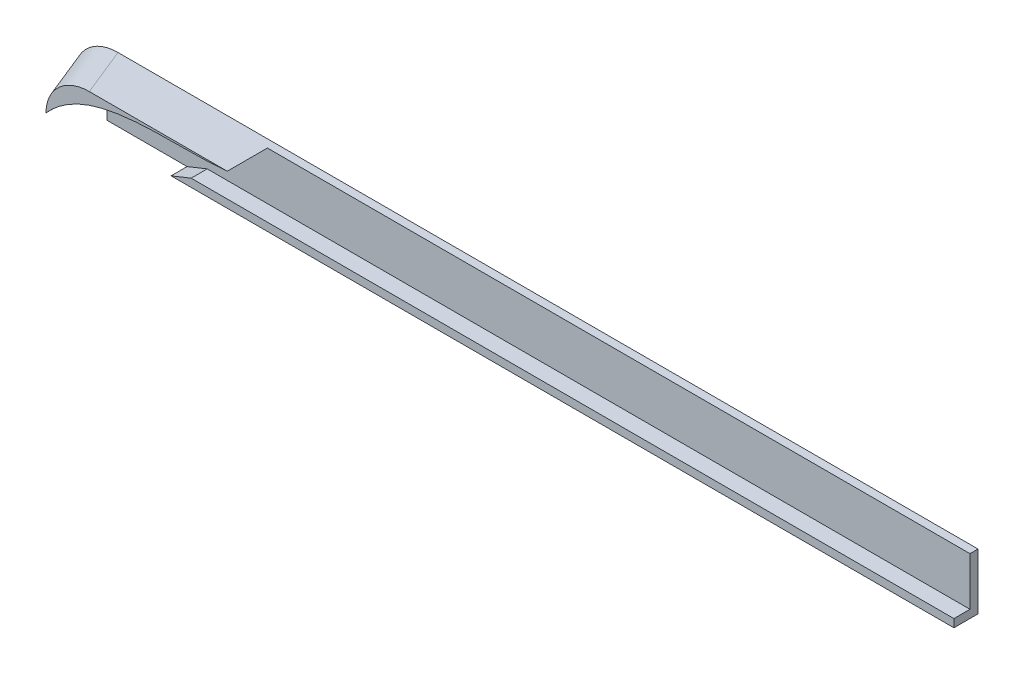
ISO-10303-21;
HEADER;
FILE_DESCRIPTION(('STEP AP214'),'2;1');
FILE_NAME('part.step','',(''),(''),'','','');
FILE_SCHEMA(('AUTOMOTIVE_DESIGN { 1 0 10303 214 1 1 1 1 }'));
ENDSEC;
DATA;
#1=APPLICATION_CONTEXT('core data for automotive mechanical design processes');
#2=APPLICATION_PROTOCOL_DEFINITION('international standard','automotive_design',2000,#1);
#3=PRODUCT_CONTEXT('',#1,'mechanical');
#4=PRODUCT('Part','Part','',(#3));
#5=PRODUCT_RELATED_PRODUCT_CATEGORY('part','',(#4));
#6=PRODUCT_DEFINITION_FORMATION('','',#4);
#7=PRODUCT_DEFINITION_CONTEXT('part definition',#1,'design');
#8=PRODUCT_DEFINITION('design','',#6,#7);
#9=PRODUCT_DEFINITION_SHAPE('','',#8);
#10=(LENGTH_UNIT() NAMED_UNIT(*) SI_UNIT(.MILLI.,.METRE.));
#11=(NAMED_UNIT(*) PLANE_ANGLE_UNIT() SI_UNIT($,.RADIAN.));
#12=(NAMED_UNIT(*) SI_UNIT($,.STERADIAN.) SOLID_ANGLE_UNIT());
#13=UNCERTAINTY_MEASURE_WITH_UNIT(LENGTH_MEASURE(1.E-05),#10,'distance_accuracy_value','');
#14=(GEOMETRIC_REPRESENTATION_CONTEXT(3) GLOBAL_UNCERTAINTY_ASSIGNED_CONTEXT((#13)) GLOBAL_UNIT_ASSIGNED_CONTEXT((#10,
#11,#12)) REPRESENTATION_CONTEXT('',''));
#15=CARTESIAN_POINT('',(0.,0.,0.));
#16=DIRECTION('',(0.,0.,1.));
#17=DIRECTION('',(1.,0.,0.));
#18=AXIS2_PLACEMENT_3D('',#15,#16,#17);
#19=CARTESIAN_POINT('',(-186.05,8.825,2.));
#20=DIRECTION('',(1.,0.,0.));
#21=DIRECTION('',(0.,0.,-1.));
#22=AXIS2_PLACEMENT_3D('',#19,#20,#21);
#23=PLANE('',#22);
#24=DIRECTION('',(0.,0.,-1.));
#25=VECTOR('',#24,1.);
#26=CARTESIAN_POINT('',(-186.05,-5.175,2.));
#27=LINE('',#26,#25);
#28=CARTESIAN_POINT('',(-186.05,-5.175,2.));
#29=VERTEX_POINT('',#28);
#30=CARTESIAN_POINT('',(-186.05,-5.175,0.));
#31=VERTEX_POINT('',#30);
#32=EDGE_CURVE('E209',#29,#31,#27,.T.);
#33=ORIENTED_EDGE('',*,*,#32,.F.);
#34=DIRECTION('',(0.,-1.,0.));
#35=VECTOR('',#34,1.);
#36=CARTESIAN_POINT('',(-186.05,8.825,2.));
#37=LINE('',#36,#35);
#38=CARTESIAN_POINT('',(-186.05,-1.17500000000001,2.));
#39=VERTEX_POINT('',#38);
#40=EDGE_CURVE('E190',#39,#29,#37,.T.);
#41=ORIENTED_EDGE('',*,*,#40,.F.);
#42=DIRECTION('',(0.,0.,-1.));
#43=VECTOR('',#42,1.);
#44=CARTESIAN_POINT('',(-186.05,-1.175,2.));
#45=LINE('',#44,#43);
#46=CARTESIAN_POINT('',(-186.05,-1.175,0.));
#47=VERTEX_POINT('',#46);
#48=EDGE_CURVE('E141',#39,#47,#45,.T.);
#49=ORIENTED_EDGE('',*,*,#48,.T.);
#50=DIRECTION('',(0.,-1.,0.));
#51=VECTOR('',#50,1.);
#52=CARTESIAN_POINT('',(-186.05,8.825,0.));
#53=LINE('',#52,#51);
#54=EDGE_CURVE('E189',#47,#31,#53,.T.);
#55=ORIENTED_EDGE('',*,*,#54,.T.);
#56=EDGE_LOOP('',(#33,#41,#49,#55));
#57=FACE_BOUND('',#56,.T.);
#58=ADVANCED_FACE('F39',(#57),#23,.F.);
#59=CARTESIAN_POINT('',(-186.05,-5.175,2.));
#60=DIRECTION('',(0.,1.,0.));
#61=DIRECTION('',(-1.,0.,0.));
#62=AXIS2_PLACEMENT_3D('',#59,#60,#61);
#63=PLANE('',#62);
#64=DIRECTION('',(1.,0.,0.));
#65=VECTOR('',#64,1.);
#66=CARTESIAN_POINT('',(-186.05,-5.175,6.));
#67=LINE('',#66,#65);
#68=CARTESIAN_POINT('',(-166.05,-5.175,6.));
#69=VERTEX_POINT('',#68);
#70=CARTESIAN_POINT('',(28.95,-5.175,6.));
#71=VERTEX_POINT('',#70);
#72=EDGE_CURVE('E177',#69,#71,#67,.T.);
#73=ORIENTED_EDGE('',*,*,#72,.F.);
#74=DIRECTION('',(0.,0.,1.));
#75=VECTOR('',#74,1.);
#76=CARTESIAN_POINT('',(-166.05,-5.175,2.));
#77=LINE('',#76,#75);
#78=CARTESIAN_POINT('',(-166.05,-5.175,2.));
#79=VERTEX_POINT('',#78);
#80=EDGE_CURVE('E167',#79,#69,#77,.T.);
#81=ORIENTED_EDGE('',*,*,#80,.F.);
#82=DIRECTION('',(1.,0.,0.));
#83=VECTOR('',#82,1.);
#84=CARTESIAN_POINT('',(-166.05,-5.175,2.));
#85=LINE('',#84,#83);
#86=EDGE_CURVE('E161',#29,#79,#85,.T.);
#87=ORIENTED_EDGE('',*,*,#86,.F.);
#88=ORIENTED_EDGE('',*,*,#32,.T.);
#89=DIRECTION('',(1.,0.,0.));
#90=VECTOR('',#89,1.);
#91=CARTESIAN_POINT('',(-186.05,-5.175,0.));
#92=LINE('',#91,#90);
#93=CARTESIAN_POINT('',(28.95,-5.175,0.));
#94=VERTEX_POINT('',#93);
#95=EDGE_CURVE('E199',#31,#94,#92,.T.);
#96=ORIENTED_EDGE('',*,*,#95,.T.);
#97=DIRECTION('',(0.,0.,-1.));
#98=VECTOR('',#97,1.);
#99=CARTESIAN_POINT('',(28.95,-5.175,2.));
#100=LINE('',#99,#98);
#101=EDGE_CURVE('E206',#71,#94,#100,.T.);
#102=ORIENTED_EDGE('',*,*,#101,.F.);
#103=EDGE_LOOP('',(#73,#81,#87,#88,#96,#102));
#104=FACE_BOUND('',#103,.T.);
#105=ADVANCED_FACE('F215',(#104),#63,.F.);
#106=CARTESIAN_POINT('',(28.95,8.825,2.));
#107=DIRECTION('',(-1.,0.,0.));
#108=DIRECTION('',(0.,0.,1.));
#109=AXIS2_PLACEMENT_3D('',#106,#107,#108);
#110=PLANE('',#109);
#111=DIRECTION('',(0.,1.,0.));
#112=VECTOR('',#111,1.);
#113=CARTESIAN_POINT('',(28.95,8.825,0.));
#114=LINE('',#113,#112);
#115=CARTESIAN_POINT('',(28.95,8.825,0.));
#116=VERTEX_POINT('',#115);
#117=EDGE_CURVE('E201',#94,#116,#114,.T.);
#118=ORIENTED_EDGE('',*,*,#117,.T.);
#119=DIRECTION('',(0.,0.,-1.));
#120=VECTOR('',#119,1.);
#121=CARTESIAN_POINT('',(28.95,8.825,2.));
#122=LINE('',#121,#120);
#123=CARTESIAN_POINT('',(28.95,8.825,2.));
#124=VERTEX_POINT('',#123);
#125=EDGE_CURVE('E196',#124,#116,#122,.T.);
#126=ORIENTED_EDGE('',*,*,#125,.F.);
#127=DIRECTION('',(0.,1.,0.));
#128=VECTOR('',#127,1.);
#129=CARTESIAN_POINT('',(28.95,8.825,2.));
#130=LINE('',#129,#128);
#131=CARTESIAN_POINT('',(28.95,-3.175,2.));
#132=VERTEX_POINT('',#131);
#133=EDGE_CURVE('E192',#132,#124,#130,.T.);
#134=ORIENTED_EDGE('',*,*,#133,.F.);
#135=DIRECTION('',(0.,0.,-1.));
#136=VECTOR('',#135,1.);
#137=CARTESIAN_POINT('',(28.95,-3.175,6.));
#138=LINE('',#137,#136);
#139=CARTESIAN_POINT('',(28.95,-3.175,6.));
#140=VERTEX_POINT('',#139);
#141=EDGE_CURVE('E184',#140,#132,#138,.T.);
#142=ORIENTED_EDGE('',*,*,#141,.F.);
#143=DIRECTION('',(0.,1.,0.));
#144=VECTOR('',#143,1.);
#145=CARTESIAN_POINT('',(28.95,-5.175,6.));
#146=LINE('',#145,#144);
#147=EDGE_CURVE('E179',#71,#140,#146,.T.);
#148=ORIENTED_EDGE('',*,*,#147,.F.);
#149=ORIENTED_EDGE('',*,*,#101,.T.);
#150=EDGE_LOOP('',(#118,#126,#134,#142,#148,#149));
#151=FACE_BOUND('',#150,.T.);
#152=ADVANCED_FACE('F225',(#151),#110,.F.);
#153=CARTESIAN_POINT('',(-186.05,8.825,2.));
#154=DIRECTION('',(0.,-1.,0.));
#155=DIRECTION('',(0.,0.,-1.));
#156=AXIS2_PLACEMENT_3D('',#153,#154,#155);
#157=PLANE('',#156);
#158=DIRECTION('',(-1.,0.,0.));
#159=VECTOR('',#158,1.);
#160=CARTESIAN_POINT('',(-186.05,8.825,0.));
#161=LINE('',#160,#159);
#162=CARTESIAN_POINT('',(-185.264652573224,8.825,0.));
#163=VERTEX_POINT('',#162);
#164=EDGE_CURVE('E193',#116,#163,#161,.T.);
#165=ORIENTED_EDGE('',*,*,#164,.T.);
#166=DIRECTION('',(-0.374606593415917,0.,-0.927183854566786));
#167=VECTOR('',#166,1.);
#168=CARTESIAN_POINT('',(-184.680202085566,8.825,1.44656571847451));
#169=LINE('',#168,#167);
#170=CARTESIAN_POINT('',(-180.416337863202,8.82499999999999,12.));
#171=VERTEX_POINT('',#170);
#172=EDGE_CURVE('E47',#163,#171,#169,.F.);
#173=ORIENTED_EDGE('',*,*,#172,.T.);
#174=DIRECTION('',(1.,0.,0.));
#175=VECTOR('',#174,1.);
#176=CARTESIAN_POINT('',(-196.05,8.82499999999999,12.));
#177=LINE('',#176,#175);
#178=CARTESIAN_POINT('',(-146.05,8.82499999999999,12.));
#179=VERTEX_POINT('',#178);
#180=EDGE_CURVE('E158',#171,#179,#177,.T.);
#181=ORIENTED_EDGE('',*,*,#180,.T.);
#182=DIRECTION('',(0.,0.,1.));
#183=VECTOR('',#182,1.);
#184=CARTESIAN_POINT('',(-146.05,8.825,2.));
#185=LINE('',#184,#183);
#186=CARTESIAN_POINT('',(-146.05,8.82499999999999,2.));
#187=VERTEX_POINT('',#186);
#188=EDGE_CURVE('E156',#187,#179,#185,.T.);
#189=ORIENTED_EDGE('',*,*,#188,.F.);
#190=DIRECTION('',(-1.,0.,0.));
#191=VECTOR('',#190,1.);
#192=CARTESIAN_POINT('',(-186.05,8.825,2.));
#193=LINE('',#192,#191);
#194=EDGE_CURVE('E137',#124,#187,#193,.T.);
#195=ORIENTED_EDGE('',*,*,#194,.F.);
#196=ORIENTED_EDGE('',*,*,#125,.T.);
#197=EDGE_LOOP('',(#165,#173,#181,#189,#195,#196));
#198=FACE_BOUND('',#197,.T.);
#199=ADVANCED_FACE('F228',(#198),#157,.F.);
#200=CARTESIAN_POINT('',(0.,0.,2.));
#201=DIRECTION('',(0.,0.,1.));
#202=DIRECTION('',(1.,0.,0.));
#203=AXIS2_PLACEMENT_3D('',#200,#201,#202);
#204=PLANE('',#203);
#205=DIRECTION('',(1.,0.,0.));
#206=VECTOR('',#205,1.);
#207=CARTESIAN_POINT('',(-191.201685289978,-1.17500000000001,2.));
#208=LINE('',#207,#206);
#209=CARTESIAN_POINT('',(-191.201685289978,-1.17500000000001,2.));
#210=VERTEX_POINT('',#209);
#211=EDGE_CURVE('E130',#210,#39,#208,.T.);
#212=ORIENTED_EDGE('',*,*,#211,.T.);
#213=ORIENTED_EDGE('',*,*,#40,.T.);
#214=ORIENTED_EDGE('',*,*,#86,.T.);
#215=DIRECTION('',(0.928476690885259,0.371390676354104,0.));
#216=VECTOR('',#215,1.);
#217=CARTESIAN_POINT('',(-161.05,-3.175,2.));
#218=LINE('',#217,#216);
#219=CARTESIAN_POINT('',(-161.05,-3.175,2.));
#220=VERTEX_POINT('',#219);
#221=EDGE_CURVE('E164',#79,#220,#218,.T.);
#222=ORIENTED_EDGE('',*,*,#221,.T.);
#223=DIRECTION('',(-1.,0.,0.));
#224=VECTOR('',#223,1.);
#225=CARTESIAN_POINT('',(-186.05,-3.175,2.));
#226=LINE('',#225,#224);
#227=EDGE_CURVE('E176',#132,#220,#226,.T.);
#228=ORIENTED_EDGE('',*,*,#227,.F.);
#229=ORIENTED_EDGE('',*,*,#133,.T.);
#230=ORIENTED_EDGE('',*,*,#194,.T.);
#231=CARTESIAN_POINT('',(-146.05,8.82499999999999,2.));
#232=CARTESIAN_POINT('',(-160.70624820226,7.33433041919374,2.));
#233=CARTESIAN_POINT('',(-180.093995007312,11.3348953174349,2.));
#234=CARTESIAN_POINT('',(-191.201685289978,-1.17500000000001,2.));
#235=B_SPLINE_CURVE_WITH_KNOTS('',3,(#231,#232,#233,#234),.UNSPECIFIED.,.F.,.F.,(4,4),(0.,1.),.UNSPECIFIED.);
#236=EDGE_CURVE('E122',#187,#210,#235,.T.);
#237=ORIENTED_EDGE('',*,*,#236,.T.);
#238=EDGE_LOOP('',(#212,#213,#214,#222,#228,#229,#230,#237));
#239=FACE_BOUND('',#238,.T.);
#240=ADVANCED_FACE('F134',(#239),#204,.T.);
#241=CARTESIAN_POINT('',(0.,0.,0.));
#242=DIRECTION('',(0.,0.,1.));
#243=DIRECTION('',(1.,0.,0.));
#244=AXIS2_PLACEMENT_3D('',#241,#242,#243);
#245=PLANE('',#244);
#246=DIRECTION('',(-1.,0.,0.));
#247=VECTOR('',#246,1.);
#248=CARTESIAN_POINT('',(-186.05,-1.175,0.));
#249=LINE('',#248,#247);
#250=CARTESIAN_POINT('',(-196.05,-1.175,0.));
#251=VERTEX_POINT('',#250);
#252=EDGE_CURVE('E172',#47,#251,#249,.T.);
#253=ORIENTED_EDGE('',*,*,#252,.T.);
#254=CARTESIAN_POINT('',(-185.264652573224,-1.175,0.));
#255=DIRECTION('',(0.,0.,1.));
#256=DIRECTION('',(-1.,0.,0.));
#257=AXIS2_PLACEMENT_3D('',#254,#255,#256);
#258=ELLIPSE('',#257,10.7853474267759,10.);
#259=EDGE_CURVE('E61',#251,#163,#258,.F.);
#260=ORIENTED_EDGE('',*,*,#259,.T.);
#261=ORIENTED_EDGE('',*,*,#164,.F.);
#262=ORIENTED_EDGE('',*,*,#117,.F.);
#263=ORIENTED_EDGE('',*,*,#95,.F.);
#264=ORIENTED_EDGE('',*,*,#54,.F.);
#265=EDGE_LOOP('',(#253,#260,#261,#262,#263,#264));
#266=FACE_BOUND('',#265,.T.);
#267=ADVANCED_FACE('F222',(#266),#245,.F.);
#268=CARTESIAN_POINT('',(-186.05,-3.175,6.));
#269=DIRECTION('',(0.,-1.,0.));
#270=DIRECTION('',(0.,0.,-1.));
#271=AXIS2_PLACEMENT_3D('',#268,#269,#270);
#272=PLANE('',#271);
#273=ORIENTED_EDGE('',*,*,#227,.T.);
#274=DIRECTION('',(0.,0.,1.));
#275=VECTOR('',#274,1.);
#276=CARTESIAN_POINT('',(-161.05,-3.175,2.));
#277=LINE('',#276,#275);
#278=CARTESIAN_POINT('',(-161.05,-3.175,6.));
#279=VERTEX_POINT('',#278);
#280=EDGE_CURVE('E169',#220,#279,#277,.T.);
#281=ORIENTED_EDGE('',*,*,#280,.T.);
#282=DIRECTION('',(-1.,0.,0.));
#283=VECTOR('',#282,1.);
#284=CARTESIAN_POINT('',(-186.05,-3.175,6.));
#285=LINE('',#284,#283);
#286=EDGE_CURVE('E181',#140,#279,#285,.T.);
#287=ORIENTED_EDGE('',*,*,#286,.F.);
#288=ORIENTED_EDGE('',*,*,#141,.T.);
#289=EDGE_LOOP('',(#273,#281,#287,#288));
#290=FACE_BOUND('',#289,.T.);
#291=ADVANCED_FACE('F253',(#290),#272,.F.);
#292=CARTESIAN_POINT('',(0.,0.,6.));
#293=DIRECTION('',(0.,0.,-1.));
#294=DIRECTION('',(-1.,0.,0.));
#295=AXIS2_PLACEMENT_3D('',#292,#293,#294);
#296=PLANE('',#295);
#297=ORIENTED_EDGE('',*,*,#286,.T.);
#298=DIRECTION('',(0.928476690885259,0.371390676354104,0.));
#299=VECTOR('',#298,1.);
#300=CARTESIAN_POINT('',(-161.05,-3.175,6.));
#301=LINE('',#300,#299);
#302=EDGE_CURVE('E160',#69,#279,#301,.T.);
#303=ORIENTED_EDGE('',*,*,#302,.F.);
#304=ORIENTED_EDGE('',*,*,#72,.T.);
#305=ORIENTED_EDGE('',*,*,#147,.T.);
#306=EDGE_LOOP('',(#297,#303,#304,#305));
#307=FACE_BOUND('',#306,.T.);
#308=ADVANCED_FACE('F258',(#307),#296,.F.);
#309=CARTESIAN_POINT('',(-186.05,-1.175,2.));
#310=DIRECTION('',(0.,-1.,0.));
#311=DIRECTION('',(0.,0.,-1.));
#312=AXIS2_PLACEMENT_3D('',#309,#310,#311);
#313=PLANE('',#312);
#314=DIRECTION('',(0.,0.,1.));
#315=VECTOR('',#314,1.);
#316=CARTESIAN_POINT('',(-191.201685289978,-1.17500000000001,2.));
#317=LINE('',#316,#315);
#318=CARTESIAN_POINT('',(-191.201685289978,-1.17500000000001,12.));
#319=VERTEX_POINT('',#318);
#320=EDGE_CURVE('E119',#210,#319,#317,.T.);
#321=ORIENTED_EDGE('',*,*,#320,.T.);
#322=DIRECTION('',(0.374606593415917,0.,0.927183854566786));
#323=VECTOR('',#322,1.);
#324=CARTESIAN_POINT('',(-193.952040631234,-1.175,5.19263165263367));
#325=LINE('',#324,#323);
#326=EDGE_CURVE('E129',#251,#319,#325,.T.);
#327=ORIENTED_EDGE('',*,*,#326,.F.);
#328=ORIENTED_EDGE('',*,*,#252,.F.);
#329=ORIENTED_EDGE('',*,*,#48,.F.);
#330=ORIENTED_EDGE('',*,*,#211,.F.);
#331=EDGE_LOOP('',(#321,#327,#328,#329,#330));
#332=FACE_BOUND('',#331,.T.);
#333=ADVANCED_FACE('F139',(#332),#313,.T.);
#334=CARTESIAN_POINT('',(-161.05,-3.175,2.));
#335=DIRECTION('',(0.371390676354104,-0.928476690885259,0.));
#336=DIRECTION('',(0.928476690885259,0.371390676354104,0.));
#337=AXIS2_PLACEMENT_3D('',#334,#335,#336);
#338=PLANE('',#337);
#339=ORIENTED_EDGE('',*,*,#302,.T.);
#340=ORIENTED_EDGE('',*,*,#280,.F.);
#341=ORIENTED_EDGE('',*,*,#221,.F.);
#342=ORIENTED_EDGE('',*,*,#80,.T.);
#343=EDGE_LOOP('',(#339,#340,#341,#342));
#344=FACE_BOUND('',#343,.T.);
#345=ADVANCED_FACE('F239',(#344),#338,.F.);
#346=CARTESIAN_POINT('',(-196.05,8.82499999999999,12.));
#347=DIRECTION('',(0.,0.,1.));
#348=DIRECTION('',(0.,-1.,0.));
#349=AXIS2_PLACEMENT_3D('',#346,#347,#348);
#350=PLANE('',#349);
#351=CARTESIAN_POINT('',(-146.05,8.82499999999999,12.));
#352=CARTESIAN_POINT('',(-160.70624820226,7.33433041919374,12.));
#353=CARTESIAN_POINT('',(-180.093995007312,11.3348953174349,12.));
#354=CARTESIAN_POINT('',(-191.201685289978,-1.17500000000001,12.));
#355=B_SPLINE_CURVE_WITH_KNOTS('',3,(#351,#352,#353,#354),.UNSPECIFIED.,.F.,.F.,(4,4),(0.,1.),.UNSPECIFIED.);
#356=EDGE_CURVE('E125',#179,#319,#355,.T.);
#357=ORIENTED_EDGE('',*,*,#356,.F.);
#358=ORIENTED_EDGE('',*,*,#180,.F.);
#359=CARTESIAN_POINT('',(-180.416337863202,-1.175,12.));
#360=DIRECTION('',(0.,0.,1.));
#361=DIRECTION('',(-1.,0.,0.));
#362=AXIS2_PLACEMENT_3D('',#359,#360,#361);
#363=ELLIPSE('',#362,10.7853474267759,10.);
#364=EDGE_CURVE('E11',#171,#319,#363,.T.);
#365=ORIENTED_EDGE('',*,*,#364,.T.);
#366=EDGE_LOOP('',(#357,#358,#365));
#367=FACE_BOUND('',#366,.T.);
#368=ADVANCED_FACE('F230',(#367),#350,.T.);
#369=CARTESIAN_POINT('',(-186.778161454332,-1.175,-3.74606593415917));
#370=DIRECTION('',(-0.374606593415917,0.,-0.927183854566786));
#371=DIRECTION('',(-0.927183854566786,0.,0.374606593415917));
#372=AXIS2_PLACEMENT_3D('',#369,#370,#371);
#373=CYLINDRICAL_SURFACE('',#372,10.);
#374=ORIENTED_EDGE('',*,*,#364,.F.);
#375=ORIENTED_EDGE('',*,*,#172,.F.);
#376=ORIENTED_EDGE('',*,*,#259,.F.);
#377=ORIENTED_EDGE('',*,*,#326,.T.);
#378=EDGE_LOOP('',(#374,#375,#376,#377));
#379=FACE_BOUND('',#378,.T.);
#380=ADVANCED_FACE('F41',(#379),#373,.T.);
#381=DIRECTION('',(0.,0.,1.));
#382=VECTOR('',#381,1.);
#383=SURFACE_OF_LINEAR_EXTRUSION('',#235,#382);
#384=ORIENTED_EDGE('',*,*,#356,.T.);
#385=ORIENTED_EDGE('',*,*,#320,.F.);
#386=ORIENTED_EDGE('',*,*,#236,.F.);
#387=ORIENTED_EDGE('',*,*,#188,.T.);
#388=EDGE_LOOP('',(#384,#385,#386,#387));
#389=FACE_BOUND('',#388,.T.);
#390=ADVANCED_FACE('F121',(#389),#383,.F.);
#391=CLOSED_SHELL('',(#58,#105,#152,#199,#240,#267,#291,#308,#333,#345,#368,#380,#390));
#392=MANIFOLD_SOLID_BREP('B2',#391);
#393=ADVANCED_BREP_SHAPE_REPRESENTATION('',(#18,#392),#14);
#394=SHAPE_DEFINITION_REPRESENTATION(#9,#393);
ENDSEC;
END-ISO-10303-21;
